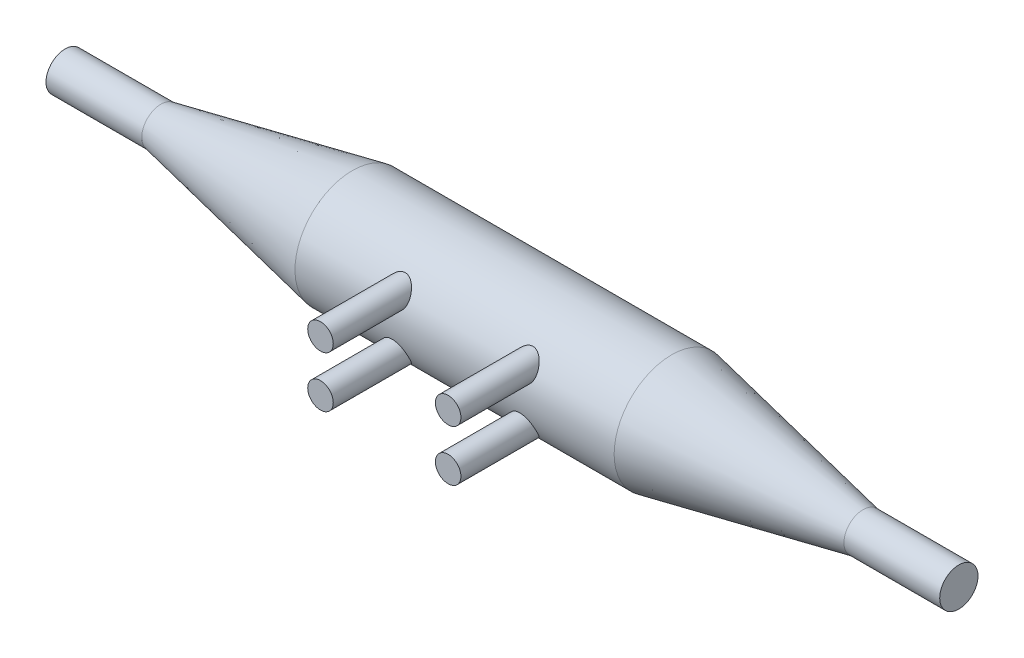
ISO-10303-21;
HEADER;
FILE_DESCRIPTION(('STEP AP214'),'2;1');
FILE_NAME('part.step','',(''),(''),'','','');
FILE_SCHEMA(('AUTOMOTIVE_DESIGN { 1 0 10303 214 1 1 1 1 }'));
ENDSEC;
DATA;
#1=APPLICATION_CONTEXT('core data for automotive mechanical design processes');
#2=APPLICATION_PROTOCOL_DEFINITION('international standard','automotive_design',2000,#1);
#3=PRODUCT_CONTEXT('',#1,'mechanical');
#4=PRODUCT('Part','Part','',(#3));
#5=PRODUCT_RELATED_PRODUCT_CATEGORY('part','',(#4));
#6=PRODUCT_DEFINITION_FORMATION('','',#4);
#7=PRODUCT_DEFINITION_CONTEXT('part definition',#1,'design');
#8=PRODUCT_DEFINITION('design','',#6,#7);
#9=PRODUCT_DEFINITION_SHAPE('','',#8);
#10=(LENGTH_UNIT() NAMED_UNIT(*) SI_UNIT(.MILLI.,.METRE.));
#11=(NAMED_UNIT(*) PLANE_ANGLE_UNIT() SI_UNIT($,.RADIAN.));
#12=(NAMED_UNIT(*) SI_UNIT($,.STERADIAN.) SOLID_ANGLE_UNIT());
#13=UNCERTAINTY_MEASURE_WITH_UNIT(LENGTH_MEASURE(1.E-05),#10,'distance_accuracy_value','');
#14=(GEOMETRIC_REPRESENTATION_CONTEXT(3) GLOBAL_UNCERTAINTY_ASSIGNED_CONTEXT((#13)) GLOBAL_UNIT_ASSIGNED_CONTEXT((#10,
#11,#12)) REPRESENTATION_CONTEXT('',''));
#15=CARTESIAN_POINT('',(0.,0.,0.));
#16=DIRECTION('',(0.,0.,1.));
#17=DIRECTION('',(1.,0.,0.));
#18=AXIS2_PLACEMENT_3D('',#15,#16,#17);
#19=CARTESIAN_POINT('',(123.259169382463,0.,0.));
#20=DIRECTION('',(1.,0.,0.));
#21=DIRECTION('',(0.,1.,0.));
#22=AXIS2_PLACEMENT_3D('',#19,#20,#21);
#23=CYLINDRICAL_SURFACE('',#22,9.);
#24=CARTESIAN_POINT('',(61.2591693824631,3.99999999999999,8.06225774829855));
#25=CARTESIAN_POINT('',(61.2591714976189,4.12894286634209,7.99828035942443));
#26=CARTESIAN_POINT('',(61.2716561331025,4.25636317802112,7.93117108595877));
#27=CARTESIAN_POINT('',(61.319719987755,4.50453397744185,7.79290857464164));
#28=CARTESIAN_POINT('',(61.3553252244888,4.62527678469448,7.72175086349652));
#29=CARTESIAN_POINT('',(61.4477930596246,4.85699742894243,7.57813396711227));
#30=CARTESIAN_POINT('',(61.5046033625781,4.96799846586629,7.50567839770059));
#31=CARTESIAN_POINT('',(61.6382866022753,5.17824136437868,7.36220031286894));
#32=CARTESIAN_POINT('',(61.7151531335041,5.27748696570533,7.29117734769489));
#33=CARTESIAN_POINT('',(61.8758580532884,5.44851310528983,7.16403562594676));
#34=CARTESIAN_POINT('',(61.9571375160229,5.52219197700484,7.10723607487638));
#35=CARTESIAN_POINT('',(62.1335477857292,5.65688001901286,7.00050468601119));
#36=CARTESIAN_POINT('',(62.2286586521216,5.717907127074,6.95056315927194));
#37=CARTESIAN_POINT('',(62.4096514297126,5.81283201869437,6.87124103534053));
#38=CARTESIAN_POINT('',(62.4930199570994,5.84974382593508,6.83975177537049));
#39=CARTESIAN_POINT('',(62.6665861314915,5.91241586631125,6.78565094760879));
#40=CARTESIAN_POINT('',(62.7567776843755,5.93818591592911,6.76303156662231));
#41=CARTESIAN_POINT('',(62.9426795345743,5.97709611066786,6.72867160916216));
#42=CARTESIAN_POINT('',(63.038427047456,5.99013726085479,6.71701632740416));
#43=CARTESIAN_POINT('',(63.2314938270432,6.00214135784504,6.70629375313919));
#44=CARTESIAN_POINT('',(63.3288122132202,6.00111193549045,6.70721963753282));
#45=CARTESIAN_POINT('',(63.5096647599325,5.98607267638007,6.72063993539285));
#46=CARTESIAN_POINT('',(63.5934463000822,5.97364265482082,6.73172624829218));
#47=CARTESIAN_POINT('',(63.7572436070403,5.93879796172869,6.76248579107337));
#48=CARTESIAN_POINT('',(63.8372584597572,5.91638088022875,6.78216109353229));
#49=CARTESIAN_POINT('',(63.9959460978089,5.8613361263742,6.8297963028568));
#50=CARTESIAN_POINT('',(64.0743458140676,5.82824894695552,6.85812523054905));
#51=CARTESIAN_POINT('',(64.224420522914,5.75366083402505,6.92082123981718));
#52=CARTESIAN_POINT('',(64.2960902710201,5.71215341715547,6.95519297145433));
#53=CARTESIAN_POINT('',(64.4659996679798,5.59952552075418,7.04647541229048));
#54=CARTESIAN_POINT('',(64.5598192136922,5.52391986035748,7.10611804947971));
#55=CARTESIAN_POINT('',(64.7308194381208,5.35954219989074,7.23090582968093));
#56=CARTESIAN_POINT('',(64.807973174702,5.27074926636729,7.29605964902877));
#57=CARTESIAN_POINT('',(64.9459064370894,5.08111744991,7.42938965369951));
#58=CARTESIAN_POINT('',(65.0064789752838,4.9801471354169,7.49759267611869));
#59=CARTESIAN_POINT('',(65.1091384320329,4.76902020080054,7.63362460007947));
#60=CARTESIAN_POINT('',(65.1512281289203,4.65886496431493,7.70145355633586));
#61=CARTESIAN_POINT('',(65.2189672178032,4.41971970238256,7.84137353680838));
#62=CARTESIAN_POINT('',(65.2424941703724,4.28995570157253,7.91319067660219));
#63=CARTESIAN_POINT('',(65.2634050975815,4.02526050938796,8.05105623263003));
#64=CARTESIAN_POINT('',(65.2607940115788,3.89033029908306,8.11710573640619));
#65=CARTESIAN_POINT('',(65.2286393274979,3.62956745613372,8.23683086029777));
#66=CARTESIAN_POINT('',(65.2009835084253,3.50375547837379,8.2910478214332));
#67=CARTESIAN_POINT('',(65.120522554561,3.256922690931,8.39107526808627));
#68=CARTESIAN_POINT('',(65.0677419246999,3.13589733702469,8.43689388456359));
#69=CARTESIAN_POINT('',(64.9453721211585,2.91813526407127,8.51447437291231));
#70=CARTESIAN_POINT('',(64.8785201147512,2.82022044132328,8.547259029167));
#71=CARTESIAN_POINT('',(64.7272409266857,2.63658792078015,8.60567781952309));
#72=CARTESIAN_POINT('',(64.642821721995,2.5508647166171,8.63131518676743));
#73=CARTESIAN_POINT('',(64.4659385481601,2.40121829894836,8.67408590301764));
#74=CARTESIAN_POINT('',(64.3745747317556,2.3361329426058,8.69171772859771));
#75=CARTESIAN_POINT('',(64.1815926991063,2.22188298842516,8.72162459247042));
#76=CARTESIAN_POINT('',(64.0799762920694,2.17271558807147,8.73390057384551));
#77=CARTESIAN_POINT('',(63.8722567725793,2.09312381075841,8.75331232187594));
#78=CARTESIAN_POINT('',(63.7663388944744,2.0622455390548,8.76057338362394));
#79=CARTESIAN_POINT('',(63.5506698031292,2.01829960870119,8.77080281204677));
#80=CARTESIAN_POINT('',(63.4409187223279,2.00523133532975,8.77377132688132));
#81=CARTESIAN_POINT('',(63.2212285486073,1.99735458192708,8.77556786215419));
#82=CARTESIAN_POINT('',(63.1112925396853,2.00246395884202,8.77441450881163));
#83=CARTESIAN_POINT('',(62.8938620936641,2.03059237542131,8.76794726549786));
#84=CARTESIAN_POINT('',(62.786367620267,2.05361114865106,8.76263343742122));
#85=CARTESIAN_POINT('',(62.5768899528712,2.11679521220174,8.74758388814477));
#86=CARTESIAN_POINT('',(62.4749057549833,2.1569573673096,8.73784897546021));
#87=CARTESIAN_POINT('',(62.279306336698,2.25307646560481,8.71355789090752));
#88=CARTESIAN_POINT('',(62.18569075506,2.30903272658809,8.69900192727317));
#89=CARTESIAN_POINT('',(62.0092079799698,2.43495337971592,8.66459780827522));
#90=CARTESIAN_POINT('',(61.9263636797301,2.50494682935801,8.6447386463461));
#91=CARTESIAN_POINT('',(61.7737804581775,2.65643043337969,8.59939614696698));
#92=CARTESIAN_POINT('',(61.7040418127922,2.73792082975373,8.57391269112718));
#93=CARTESIAN_POINT('',(61.5782486541744,2.91091052214103,8.51674867028052));
#94=CARTESIAN_POINT('',(61.5224171755117,3.00254261226738,8.48498016654166));
#95=CARTESIAN_POINT('',(61.4267064699945,3.19171559160702,8.41564601450613));
#96=CARTESIAN_POINT('',(61.3868282743357,3.28925686231159,8.37807999168418));
#97=CARTESIAN_POINT('',(61.3226792121092,3.48893821901558,8.29693347822424));
#98=CARTESIAN_POINT('',(61.2986754023116,3.59112752152574,8.25326434922474));
#99=CARTESIAN_POINT('',(61.2669155663079,3.79585953040615,8.1611324512423));
#100=CARTESIAN_POINT('',(61.259167715874,3.89840238863849,8.11266728296417));
#101=CARTESIAN_POINT('',(61.2591693824631,3.99999999999999,8.06225774829855));
#102=B_SPLINE_CURVE_WITH_KNOTS('',3,(#24,#25,#26,#27,#28,#29,#30,#31,#32,#33,#34,#35,#36,#37,
#38,#39,#40,#41,#42,#43,#44,#45,#46,#47,#48,#49,#50,#51,#52,#53,#54,#55,#56,#57,#58,#59,#60,#61,
#62,#63,#64,#65,#66,#67,#68,#69,#70,#71,#72,#73,#74,#75,#76,#77,#78,#79,#80,#81,#82,#83,#84,#85,
#86,#87,#88,#89,#90,#91,#92,#93,#94,#95,#96,#97,#98,#99,#100,#101),.UNSPECIFIED.,.T.,.F.,(4,2,2,
2,2,2,2,2,2,2,2,2,2,2,2,2,2,2,2,2,2,2,2,2,2,2,2,2,2,2,2,2,2,2,2,2,2,2,4),(0.,0.431384036925384,
0.863254352620981,1.2940665620274,1.72474134761833,2.09397692398629,2.46268535999728,
2.75095537535825,3.03897088932175,3.32920891511334,3.61928954342715,3.87439949676249,
4.12957104378783,4.39766220665997,4.66596058144565,5.06713507760775,5.46895334212838,
5.87557990813472,6.28214532927037,6.73030426501385,7.1783785128669,7.59525649002182,
8.01172870490679,8.37878937071907,8.74568372278498,9.08467398018687,9.42360452246101,
9.75372677989922,10.0838376427057,10.412458664781,10.741074798119,11.0696308592682,
11.3981727310744,11.7274018499288,12.0566378996242,12.3908559014187,12.7250955030616,
13.0648239632767,13.4047232456055),.UNSPECIFIED.);
#103=CARTESIAN_POINT('',(61.2591693824631,3.99999999999999,8.06225774829855));
#104=VERTEX_POINT('',#103);
#105=EDGE_CURVE('E110',#104,#104,#102,.T.);
#106=ORIENTED_EDGE('',*,*,#105,.T.);
#107=EDGE_LOOP('',(#106));
#108=FACE_BOUND('',#107,.T.);
#109=CARTESIAN_POINT('',(41.2591693824631,3.99999999999999,8.06225774829855));
#110=CARTESIAN_POINT('',(41.2591714976189,4.12894286634209,7.99828035942443));
#111=CARTESIAN_POINT('',(41.2716561331024,4.25636317802113,7.93117108595877));
#112=CARTESIAN_POINT('',(41.3197199877549,4.50453397744185,7.79290857464164));
#113=CARTESIAN_POINT('',(41.3553252244888,4.62527678469448,7.72175086349652));
#114=CARTESIAN_POINT('',(41.4477930596246,4.85699742894243,7.57813396711227));
#115=CARTESIAN_POINT('',(41.5046033625781,4.96799846586629,7.50567839770059));
#116=CARTESIAN_POINT('',(41.6382866022753,5.17824136437868,7.36220031286893));
#117=CARTESIAN_POINT('',(41.7151531335041,5.27748696570533,7.29117734769488));
#118=CARTESIAN_POINT('',(41.8758580532883,5.44851310528984,7.16403562594676));
#119=CARTESIAN_POINT('',(41.9571375160229,5.52219197700484,7.10723607487638));
#120=CARTESIAN_POINT('',(42.1335477857292,5.65688001901286,7.00050468601119));
#121=CARTESIAN_POINT('',(42.2286586521216,5.71790712707401,6.95056315927193));
#122=CARTESIAN_POINT('',(42.4096514297126,5.81283201869437,6.87124103534052));
#123=CARTESIAN_POINT('',(42.4930199570994,5.84974382593509,6.83975177537048));
#124=CARTESIAN_POINT('',(42.6665861314915,5.91241586631126,6.78565094760878));
#125=CARTESIAN_POINT('',(42.7567776843755,5.93818591592912,6.7630315666223));
#126=CARTESIAN_POINT('',(42.9426795345743,5.97709611066786,6.72867160916215));
#127=CARTESIAN_POINT('',(43.038427047456,5.9901372608548,6.71701632740416));
#128=CARTESIAN_POINT('',(43.2314938270431,6.00214135784505,6.70629375313918));
#129=CARTESIAN_POINT('',(43.3288122132202,6.00111193549046,6.70721963753282));
#130=CARTESIAN_POINT('',(43.5096647599325,5.98607267638007,6.72063993539284));
#131=CARTESIAN_POINT('',(43.5934463000822,5.97364265482083,6.73172624829217));
#132=CARTESIAN_POINT('',(43.7572436070403,5.9387979617287,6.76248579107336));
#133=CARTESIAN_POINT('',(43.8372584597572,5.91638088022875,6.78216109353228));
#134=CARTESIAN_POINT('',(43.9959460978089,5.86133612637421,6.82979630285679));
#135=CARTESIAN_POINT('',(44.0743458140676,5.82824894695553,6.85812523054904));
#136=CARTESIAN_POINT('',(44.224420522914,5.75366083402506,6.92082123981717));
#137=CARTESIAN_POINT('',(44.2960902710201,5.71215341715548,6.95519297145433));
#138=CARTESIAN_POINT('',(44.4659996679798,5.59952552075418,7.04647541229048));
#139=CARTESIAN_POINT('',(44.5598192136922,5.52391986035748,7.10611804947971));
#140=CARTESIAN_POINT('',(44.7308194381208,5.35954219989074,7.23090582968093));
#141=CARTESIAN_POINT('',(44.807973174702,5.27074926636729,7.29605964902877));
#142=CARTESIAN_POINT('',(44.9459064370894,5.08111744990999,7.42938965369951));
#143=CARTESIAN_POINT('',(45.0064789752838,4.9801471354169,7.49759267611869));
#144=CARTESIAN_POINT('',(45.1091384320329,4.76902020080053,7.63362460007947));
#145=CARTESIAN_POINT('',(45.1512281289203,4.65886496431492,7.70145355633586));
#146=CARTESIAN_POINT('',(45.2189672178032,4.41971970238255,7.84137353680838));
#147=CARTESIAN_POINT('',(45.2424941703724,4.28995570157253,7.91319067660219));
#148=CARTESIAN_POINT('',(45.2634050975815,4.02526050938796,8.05105623263004));
#149=CARTESIAN_POINT('',(45.2607940115788,3.89033029908306,8.11710573640619));
#150=CARTESIAN_POINT('',(45.2286393274979,3.62956745613372,8.23683086029777));
#151=CARTESIAN_POINT('',(45.2009835084252,3.50375547837379,8.2910478214332));
#152=CARTESIAN_POINT('',(45.120522554561,3.25692269093099,8.39107526808627));
#153=CARTESIAN_POINT('',(45.0677419246999,3.13589733702468,8.43689388456359));
#154=CARTESIAN_POINT('',(44.9453721211585,2.91813526407126,8.51447437291231));
#155=CARTESIAN_POINT('',(44.8785201147511,2.82022044132328,8.547259029167));
#156=CARTESIAN_POINT('',(44.7272409266857,2.63658792078014,8.60567781952309));
#157=CARTESIAN_POINT('',(44.642821721995,2.55086471661709,8.63131518676744));
#158=CARTESIAN_POINT('',(44.4659385481601,2.40121829894835,8.67408590301764));
#159=CARTESIAN_POINT('',(44.3745747317556,2.3361329426058,8.69171772859771));
#160=CARTESIAN_POINT('',(44.1815926991063,2.22188298842515,8.72162459247042));
#161=CARTESIAN_POINT('',(44.0799762920694,2.17271558807146,8.73390057384551));
#162=CARTESIAN_POINT('',(43.8722567725792,2.0931238107584,8.75331232187594));
#163=CARTESIAN_POINT('',(43.7663388944744,2.06224553905479,8.76057338362394));
#164=CARTESIAN_POINT('',(43.5506698031292,2.01829960870118,8.77080281204677));
#165=CARTESIAN_POINT('',(43.4409187223279,2.00523133532974,8.77377132688132));
#166=CARTESIAN_POINT('',(43.2212285486072,1.99735458192708,8.7755678621542));
#167=CARTESIAN_POINT('',(43.1112925396853,2.00246395884201,8.77441450881163));
#168=CARTESIAN_POINT('',(42.8938620936641,2.0305923754213,8.76794726549786));
#169=CARTESIAN_POINT('',(42.786367620267,2.05361114865106,8.76263343742122));
#170=CARTESIAN_POINT('',(42.5768899528712,2.11679521220173,8.74758388814477));
#171=CARTESIAN_POINT('',(42.4749057549833,2.1569573673096,8.7378489754602));
#172=CARTESIAN_POINT('',(42.279306336698,2.25307646560481,8.71355789090752));
#173=CARTESIAN_POINT('',(42.18569075506,2.30903272658809,8.69900192727317));
#174=CARTESIAN_POINT('',(42.0092079799698,2.43495337971592,8.66459780827522));
#175=CARTESIAN_POINT('',(41.92636367973,2.50494682935801,8.6447386463461));
#176=CARTESIAN_POINT('',(41.7737804581775,2.6564304333797,8.59939614696698));
#177=CARTESIAN_POINT('',(41.7040418127921,2.73792082975374,8.57391269112718));
#178=CARTESIAN_POINT('',(41.5782486541744,2.91091052214103,8.51674867028052));
#179=CARTESIAN_POINT('',(41.5224171755117,3.00254261226738,8.48498016654165));
#180=CARTESIAN_POINT('',(41.4267064699945,3.19171559160702,8.41564601450613));
#181=CARTESIAN_POINT('',(41.3868282743357,3.28925686231159,8.37807999168418));
#182=CARTESIAN_POINT('',(41.3226792121092,3.48893821901559,8.29693347822423));
#183=CARTESIAN_POINT('',(41.2986754023116,3.59112752152575,8.25326434922474));
#184=CARTESIAN_POINT('',(41.2669155663079,3.79585953040615,8.16113245124229));
#185=CARTESIAN_POINT('',(41.259167715874,3.89840238863849,8.11266728296417));
#186=CARTESIAN_POINT('',(41.2591693824631,3.99999999999999,8.06225774829855));
#187=B_SPLINE_CURVE_WITH_KNOTS('',3,(#109,#110,#111,#112,#113,#114,#115,#116,#117,#118,#119,
#120,#121,#122,#123,#124,#125,#126,#127,#128,#129,#130,#131,#132,#133,#134,#135,#136,#137,#138,
#139,#140,#141,#142,#143,#144,#145,#146,#147,#148,#149,#150,#151,#152,#153,#154,#155,#156,#157,
#158,#159,#160,#161,#162,#163,#164,#165,#166,#167,#168,#169,#170,#171,#172,#173,#174,#175,#176,
#177,#178,#179,#180,#181,#182,#183,#184,#185,#186),.UNSPECIFIED.,.T.,.F.,(4,2,2,2,2,2,2,2,2,2,2,
2,2,2,2,2,2,2,2,2,2,2,2,2,2,2,2,2,2,2,2,2,2,2,2,2,2,2,4),(0.,0.431384036925386,
0.863254352620985,1.2940665620274,1.72474134761834,2.0939769239863,2.46268535999729,
2.75095537535826,3.03897088932175,3.32920891511334,3.61928954342715,3.87439949676251,
4.12957104378784,4.39766220665998,4.66596058144567,5.06713507760778,5.46895334212841,
5.87557990813476,6.2821453292704,6.73030426501388,7.17837851286693,7.59525649002185,
8.01172870490682,8.3787893707191,8.74568372278502,9.08467398018691,9.42360452246104,
9.75372677989927,10.0838376427057,10.412458664781,10.741074798119,11.0696308592683,
11.3981727310745,11.7274018499289,12.0566378996242,12.3908559014187,12.7250955030616,
13.0648239632767,13.4047232456055),.UNSPECIFIED.);
#188=CARTESIAN_POINT('',(41.2591693824631,3.99999999999999,8.06225774829855));
#189=VERTEX_POINT('',#188);
#190=EDGE_CURVE('E59',#189,#189,#187,.T.);
#191=ORIENTED_EDGE('',*,*,#190,.T.);
#192=EDGE_LOOP('',(#191));
#193=FACE_BOUND('',#192,.T.);
#194=CARTESIAN_POINT('',(28.2591693824631,0.,0.));
#195=DIRECTION('',(1.,0.,0.));
#196=DIRECTION('',(0.,1.,0.));
#197=AXIS2_PLACEMENT_3D('',#194,#195,#196);
#198=CIRCLE('',#197,9.00000000000001);
#199=CARTESIAN_POINT('',(28.2591693824631,9.,0.));
#200=VERTEX_POINT('',#199);
#201=EDGE_CURVE('E55',#200,#200,#198,.T.);
#202=ORIENTED_EDGE('',*,*,#201,.T.);
#203=EDGE_LOOP('',(#202));
#204=FACE_BOUND('',#203,.T.);
#205=CARTESIAN_POINT('',(78.2591693824631,0.,0.));
#206=DIRECTION('',(1.,0.,0.));
#207=DIRECTION('',(0.,1.,0.));
#208=AXIS2_PLACEMENT_3D('',#205,#206,#207);
#209=CIRCLE('',#208,8.99999999999999);
#210=CARTESIAN_POINT('',(78.2591693824631,-8.99999999999999,0.));
#211=VERTEX_POINT('',#210);
#212=EDGE_CURVE('E118',#211,#211,#209,.T.);
#213=ORIENTED_EDGE('',*,*,#212,.F.);
#214=EDGE_LOOP('',(#213));
#215=FACE_BOUND('',#214,.T.);
#216=CARTESIAN_POINT('',(41.2591693824631,-4.00000000000001,8.06225774829855));
#217=CARTESIAN_POINT('',(41.2591729859442,-3.88819498255086,8.1177251933736));
#218=CARTESIAN_POINT('',(41.2685685907921,-3.77508517782307,8.17092075009496));
#219=CARTESIAN_POINT('',(41.30721541854,-3.54944309654731,8.271441782327));
#220=CARTESIAN_POINT('',(41.3364967383582,-3.436911956295,8.31875823124603));
#221=CARTESIAN_POINT('',(41.4155272172496,-3.21591588631707,8.4066679756264));
#222=CARTESIAN_POINT('',(41.4653464534785,-3.10746627941771,8.44723757854511));
#223=CARTESIAN_POINT('',(41.5849277564581,-2.89941348659936,8.52089123641491));
#224=CARTESIAN_POINT('',(41.6546760492535,-2.79980425276625,8.5539804332487));
#225=CARTESIAN_POINT('',(41.8066973583322,-2.62045938949496,8.61054074377932));
#226=CARTESIAN_POINT('',(41.8876950670757,-2.53980633880364,8.63453538190431));
#227=CARTESIAN_POINT('',(42.0632130519027,-2.3928984550645,8.67639825696416));
#228=CARTESIAN_POINT('',(42.1577309090597,-2.32664105178206,8.69426758785626));
#229=CARTESIAN_POINT('',(42.3529015860046,-2.21371417940273,8.72368809535034));
#230=CARTESIAN_POINT('',(42.4530840575554,-2.16629475393258,8.73548832687957));
#231=CARTESIAN_POINT('',(42.660292601347,-2.08856419647635,8.75439947513368));
#232=CARTESIAN_POINT('',(42.7673180130088,-2.05825141587858,8.76151084374754));
#233=CARTESIAN_POINT('',(42.9838498777503,-2.01600656535591,8.77132754200847));
#234=CARTESIAN_POINT('',(43.0933138483301,-2.00386785521057,8.77408242570912));
#235=CARTESIAN_POINT('',(43.3127770044608,-1.99770740418875,8.77548724023928));
#236=CARTESIAN_POINT('',(43.4227761830643,-2.0036854287615,8.77413722421343));
#237=CARTESIAN_POINT('',(43.6400485693977,-2.03354596502222,8.76726416460684));
#238=CARTESIAN_POINT('',(43.7473248748113,-2.05740709246258,8.76174610502532));
#239=CARTESIAN_POINT('',(43.956242202485,-2.12222200308059,8.74627207643438));
#240=CARTESIAN_POINT('',(44.0578833814932,-2.16317531054808,8.73631623093705));
#241=CARTESIAN_POINT('',(44.2527181767486,-2.26082216125914,8.71155602780751));
#242=CARTESIAN_POINT('',(44.3459076678058,-2.31752333662496,8.69674931860299));
#243=CARTESIAN_POINT('',(44.5212248308717,-2.44470459043707,8.66185618974943));
#244=CARTESIAN_POINT('',(44.6033528953683,-2.51518417977227,8.6417699575061));
#245=CARTESIAN_POINT('',(44.7549712686839,-2.66799430440358,8.59582444728445));
#246=CARTESIAN_POINT('',(44.8243727830543,-2.75040142221722,8.5699272174494));
#247=CARTESIAN_POINT('',(44.9483379776932,-2.92385935886841,8.51230813394993));
#248=CARTESIAN_POINT('',(45.0029005275275,-3.01491083552193,8.48058583683931));
#249=CARTESIAN_POINT('',(45.0977710474321,-3.20551011891369,8.41042867822864));
#250=CARTESIAN_POINT('',(45.1376022443884,-3.30523087431734,8.37182098179081));
#251=CARTESIAN_POINT('',(45.2005036866402,-3.50759651586803,8.28907284054095));
#252=CARTESIAN_POINT('',(45.2235689877717,-3.61024225530961,8.24493076816991));
#253=CARTESIAN_POINT('',(45.2544397500707,-3.82312754935519,8.14851541370557));
#254=CARTESIAN_POINT('',(45.2610247616973,-3.93338090229953,8.09588531033252));
#255=CARTESIAN_POINT('',(45.2564171415442,-4.15131916891199,7.98632923797797));
#256=CARTESIAN_POINT('',(45.2452183844585,-4.25900318464907,7.92940179528666));
#257=CARTESIAN_POINT('',(45.2040631242515,-4.48114951889358,7.80622338609317));
#258=CARTESIAN_POINT('',(45.172192958991,-4.59506910691463,7.73963291253861));
#259=CARTESIAN_POINT('',(45.0894159397671,-4.81487016251242,7.60484632327977));
#260=CARTESIAN_POINT('',(45.0384888443836,-4.92074293875491,7.5366485728255));
#261=CARTESIAN_POINT('',(44.9129966020151,-5.13196979534894,7.39463053360367));
#262=CARTESIAN_POINT('',(44.8366492326262,-5.23632466438319,7.32088961184441));
#263=CARTESIAN_POINT('',(44.663267978129,-5.43016929205724,7.17827956260325));
#264=CARTESIAN_POINT('',(44.5662555356668,-5.51967428938179,7.109405483056));
#265=CARTESIAN_POINT('',(44.381688038508,-5.65811904566685,6.99937541279924));
#266=CARTESIAN_POINT('',(44.2988579354835,-5.71144756303145,6.95580304501223));
#267=CARTESIAN_POINT('',(44.1232736680207,-5.80644568979588,6.87669980283816));
#268=CARTESIAN_POINT('',(44.0305362741252,-5.84813458297591,6.84115564672017));
#269=CARTESIAN_POINT('',(43.8529696581547,-5.91173518548809,6.78622550888166));
#270=CARTESIAN_POINT('',(43.7694480800287,-5.93579745661685,6.76512477843832));
#271=CARTESIAN_POINT('',(43.5982145511026,-5.97299378830131,6.73230798201385));
#272=CARTESIAN_POINT('',(43.5105056727272,-5.98613573516691,6.72058514384654));
#273=CARTESIAN_POINT('',(43.3329986035714,-6.00062579069746,6.7076518284385));
#274=CARTESIAN_POINT('',(43.2431939277761,-6.00193045064402,6.70648007904929));
#275=CARTESIAN_POINT('',(43.0647295137664,-5.99253138952388,6.71487920991738));
#276=CARTESIAN_POINT('',(42.976069934178,-5.98182602242163,6.72445156270886));
#277=CARTESIAN_POINT('',(42.8072448962726,-5.95006425123586,6.75256582382558));
#278=CARTESIAN_POINT('',(42.7268791991748,-5.92959708175384,6.77059627879863));
#279=CARTESIAN_POINT('',(42.5710815493275,-5.87969123902814,6.81397987778612));
#280=CARTESIAN_POINT('',(42.4956527121974,-5.85024696545914,6.83933759236055));
#281=CARTESIAN_POINT('',(42.3214516484762,-5.77008904778911,6.90722879110724));
#282=CARTESIAN_POINT('',(42.2255132010573,-5.71558526173381,6.95256658591336));
#283=CARTESIAN_POINT('',(42.0463353817258,-5.59398902651009,7.05077335272773));
#284=CARTESIAN_POINT('',(41.963115059403,-5.52687802261082,7.1036533971018));
#285=CARTESIAN_POINT('',(41.8085984866595,-5.38105123056526,7.21476416384232));
#286=CARTESIAN_POINT('',(41.7375147629874,-5.30216666295077,7.27306706934971));
#287=CARTESIAN_POINT('',(41.6092398167879,-5.13526103107292,7.3918605880246));
#288=CARTESIAN_POINT('',(41.5520559363453,-5.04723517313959,7.45235233807304));
#289=CARTESIAN_POINT('',(41.4419583414773,-4.8447456227986,7.58590585844797));
#290=CARTESIAN_POINT('',(41.3922790530782,-4.72854627184658,7.65902169439187));
#291=CARTESIAN_POINT('',(41.3154246085588,-4.48761997835233,7.80261728677751));
#292=CARTESIAN_POINT('',(41.2881992615288,-4.36291273321513,7.87310258437512));
#293=CARTESIAN_POINT('',(41.2684872785497,-4.19676513471166,7.96172849226288));
#294=CARTESIAN_POINT('',(41.2650078080679,-4.15769235533063,7.98220181716867));
#295=CARTESIAN_POINT('',(41.2603479798012,-4.07913447120783,8.02263132252688));
#296=CARTESIAN_POINT('',(41.2591681045648,-4.03964928167291,8.04258739357178));
#297=CARTESIAN_POINT('',(41.2591693824631,-4.00000000000001,8.06225774829855));
#298=B_SPLINE_CURVE_WITH_KNOTS('',3,(#216,#217,#218,#219,#220,#221,#222,#223,#224,#225,#226,
#227,#228,#229,#230,#231,#232,#233,#234,#235,#236,#237,#238,#239,#240,#241,#242,#243,#244,#245,
#246,#247,#248,#249,#250,#251,#252,#253,#254,#255,#256,#257,#258,#259,#260,#261,#262,#263,#264,
#265,#266,#267,#268,#269,#270,#271,#272,#273,#274,#275,#276,#277,#278,#279,#280,#281,#282,#283,
#284,#285,#286,#287,#288,#289,#290,#291,#292,#293,#294,#295,#296,#297),.UNSPECIFIED.,.T.,.F.,(4,
2,2,2,2,2,2,2,2,2,2,2,2,2,2,2,2,2,2,2,2,2,2,2,2,2,2,2,2,2,2,2,2,2,2,2,2,2,2,2,4),(0.,
0.374267942088713,0.749103602732428,1.1252289623851,1.50109498944482,1.84969992810314,
2.19824257473012,2.53103241953376,2.86379018703846,3.19273495876871,3.52167547178865,
3.8502232708187,4.17876192630471,4.50746008502505,4.83614657761784,5.16704566925021,
5.49796996176234,5.83882253859479,6.17977559011071,6.54531708352482,6.91098450858127,
7.3165572042518,7.72256190956059,8.16702738151458,8.6110338910956,8.93304823364123,
9.25452587434948,9.52173622115511,9.78875342904813,10.056750327903,10.3247839615893,
10.5783656349547,10.83210582891,11.1880412522694,11.5445046886308,11.9066822218362,
12.269050648395,12.7051259700326,13.1402238777285,13.2729222347804,13.4056484343337),.UNSPECIFIED.);
#299=CARTESIAN_POINT('',(41.2591693824631,-4.00000000000001,8.06225774829855));
#300=VERTEX_POINT('',#299);
#301=EDGE_CURVE('E68',#300,#300,#298,.T.);
#302=ORIENTED_EDGE('',*,*,#301,.T.);
#303=EDGE_LOOP('',(#302));
#304=FACE_BOUND('',#303,.T.);
#305=CARTESIAN_POINT('',(61.2591693824631,-4.00000000000001,8.06225774829855));
#306=CARTESIAN_POINT('',(61.2591729859442,-3.88819498255086,8.11772519337359));
#307=CARTESIAN_POINT('',(61.2685685907922,-3.77508517782307,8.17092075009496));
#308=CARTESIAN_POINT('',(61.30721541854,-3.54944309654731,8.271441782327));
#309=CARTESIAN_POINT('',(61.3364967383582,-3.43691195629501,8.31875823124603));
#310=CARTESIAN_POINT('',(61.4155272172496,-3.21591588631707,8.4066679756264));
#311=CARTESIAN_POINT('',(61.4653464534785,-3.10746627941771,8.44723757854511));
#312=CARTESIAN_POINT('',(61.5849277564581,-2.89941348659936,8.5208912364149));
#313=CARTESIAN_POINT('',(61.6546760492535,-2.79980425276625,8.5539804332487));
#314=CARTESIAN_POINT('',(61.8066973583322,-2.62045938949496,8.61054074377932));
#315=CARTESIAN_POINT('',(61.8876950670757,-2.53980633880364,8.6345353819043));
#316=CARTESIAN_POINT('',(62.0632130519027,-2.3928984550645,8.67639825696416));
#317=CARTESIAN_POINT('',(62.1577309090597,-2.32664105178206,8.69426758785626));
#318=CARTESIAN_POINT('',(62.3529015860046,-2.21371417940273,8.72368809535034));
#319=CARTESIAN_POINT('',(62.4530840575554,-2.16629475393259,8.73548832687957));
#320=CARTESIAN_POINT('',(62.660292601347,-2.08856419647636,8.75439947513367));
#321=CARTESIAN_POINT('',(62.7673180130088,-2.05825141587859,8.76151084374754));
#322=CARTESIAN_POINT('',(62.9838498777503,-2.01600656535592,8.77132754200847));
#323=CARTESIAN_POINT('',(63.0933138483301,-2.00386785521057,8.77408242570912));
#324=CARTESIAN_POINT('',(63.3127770044608,-1.99770740418876,8.77548724023928));
#325=CARTESIAN_POINT('',(63.4227761830643,-2.00368542876151,8.77413722421343));
#326=CARTESIAN_POINT('',(63.6400485693977,-2.03354596502222,8.76726416460684));
#327=CARTESIAN_POINT('',(63.7473248748113,-2.05740709246258,8.76174610502532));
#328=CARTESIAN_POINT('',(63.9562422024851,-2.12222200308059,8.74627207643438));
#329=CARTESIAN_POINT('',(64.0578833814932,-2.16317531054809,8.73631623093705));
#330=CARTESIAN_POINT('',(64.2527181767486,-2.26082216125915,8.71155602780751));
#331=CARTESIAN_POINT('',(64.3459076678058,-2.31752333662497,8.69674931860298));
#332=CARTESIAN_POINT('',(64.5212248308717,-2.44470459043708,8.66185618974943));
#333=CARTESIAN_POINT('',(64.6033528953683,-2.51518417977227,8.64176995750609));
#334=CARTESIAN_POINT('',(64.7549712686839,-2.66799430440357,8.59582444728445));
#335=CARTESIAN_POINT('',(64.8243727830543,-2.75040142221722,8.5699272174494));
#336=CARTESIAN_POINT('',(64.9483379776932,-2.92385935886841,8.51230813394993));
#337=CARTESIAN_POINT('',(65.0029005275275,-3.01491083552193,8.48058583683931));
#338=CARTESIAN_POINT('',(65.0977710474321,-3.20551011891369,8.41042867822864));
#339=CARTESIAN_POINT('',(65.1376022443885,-3.30523087431734,8.37182098179081));
#340=CARTESIAN_POINT('',(65.2005036866402,-3.50759651586803,8.28907284054095));
#341=CARTESIAN_POINT('',(65.2235689877717,-3.61024225530961,8.24493076816991));
#342=CARTESIAN_POINT('',(65.2544397500707,-3.82312754935519,8.14851541370557));
#343=CARTESIAN_POINT('',(65.2610247616973,-3.93338090229954,8.09588531033252));
#344=CARTESIAN_POINT('',(65.2564171415442,-4.15131916891199,7.98632923797797));
#345=CARTESIAN_POINT('',(65.2452183844585,-4.25900318464907,7.92940179528666));
#346=CARTESIAN_POINT('',(65.2040631242515,-4.48114951889358,7.80622338609317));
#347=CARTESIAN_POINT('',(65.1721929589909,-4.59506910691463,7.73963291253861));
#348=CARTESIAN_POINT('',(65.0894159397671,-4.81487016251242,7.60484632327977));
#349=CARTESIAN_POINT('',(65.0384888443836,-4.92074293875491,7.5366485728255));
#350=CARTESIAN_POINT('',(64.9129966020151,-5.13196979534893,7.39463053360367));
#351=CARTESIAN_POINT('',(64.8366492326262,-5.23632466438319,7.3208896118444));
#352=CARTESIAN_POINT('',(64.663267978129,-5.43016929205724,7.17827956260325));
#353=CARTESIAN_POINT('',(64.5662555356668,-5.51967428938179,7.109405483056));
#354=CARTESIAN_POINT('',(64.381688038508,-5.65811904566684,6.99937541279924));
#355=CARTESIAN_POINT('',(64.2988579354835,-5.71144756303145,6.95580304501223));
#356=CARTESIAN_POINT('',(64.1232736680207,-5.80644568979588,6.87669980283816));
#357=CARTESIAN_POINT('',(64.0305362741252,-5.84813458297591,6.84115564672017));
#358=CARTESIAN_POINT('',(63.8529696581547,-5.91173518548809,6.78622550888167));
#359=CARTESIAN_POINT('',(63.7694480800287,-5.93579745661685,6.76512477843832));
#360=CARTESIAN_POINT('',(63.5982145511026,-5.9729937883013,6.73230798201386));
#361=CARTESIAN_POINT('',(63.5105056727272,-5.98613573516691,6.72058514384654));
#362=CARTESIAN_POINT('',(63.3329986035714,-6.00062579069745,6.70765182843851));
#363=CARTESIAN_POINT('',(63.2431939277761,-6.00193045064401,6.7064800790493));
#364=CARTESIAN_POINT('',(63.0647295137664,-5.99253138952387,6.71487920991739));
#365=CARTESIAN_POINT('',(62.976069934178,-5.98182602242162,6.72445156270887));
#366=CARTESIAN_POINT('',(62.8072448962726,-5.95006425123585,6.75256582382559));
#367=CARTESIAN_POINT('',(62.7268791991747,-5.92959708175383,6.77059627879864));
#368=CARTESIAN_POINT('',(62.5710815493275,-5.87969123902812,6.81397987778613));
#369=CARTESIAN_POINT('',(62.4956527121973,-5.85024696545913,6.83933759236057));
#370=CARTESIAN_POINT('',(62.3214516484762,-5.7700890477891,6.90722879110725));
#371=CARTESIAN_POINT('',(62.2255132010573,-5.71558526173379,6.95256658591337));
#372=CARTESIAN_POINT('',(62.0463353817258,-5.59398902651007,7.05077335272774));
#373=CARTESIAN_POINT('',(61.963115059403,-5.5268780226108,7.10365339710182));
#374=CARTESIAN_POINT('',(61.8085984866594,-5.38105123056524,7.21476416384234));
#375=CARTESIAN_POINT('',(61.7375147629874,-5.30216666295075,7.27306706934973));
#376=CARTESIAN_POINT('',(61.6092398167879,-5.13526103107289,7.39186058802461));
#377=CARTESIAN_POINT('',(61.5520559363453,-5.04723517313956,7.45235233807306));
#378=CARTESIAN_POINT('',(61.4419583414773,-4.84474562279857,7.58590585844799));
#379=CARTESIAN_POINT('',(61.3922790530782,-4.72854627184656,7.65902169439189));
#380=CARTESIAN_POINT('',(61.3154246085588,-4.4876199783523,7.80261728677752));
#381=CARTESIAN_POINT('',(61.2881992615288,-4.36291273321509,7.87310258437514));
#382=CARTESIAN_POINT('',(61.2684872785498,-4.19676513471163,7.9617284922629));
#383=CARTESIAN_POINT('',(61.2650078080679,-4.15769235533061,7.98220181716868));
#384=CARTESIAN_POINT('',(61.2603479798013,-4.07913447120782,8.02263132252688));
#385=CARTESIAN_POINT('',(61.2591681045649,-4.0396492816729,8.04258739357178));
#386=CARTESIAN_POINT('',(61.2591693824631,-4.00000000000001,8.06225774829855));
#387=B_SPLINE_CURVE_WITH_KNOTS('',3,(#305,#306,#307,#308,#309,#310,#311,#312,#313,#314,#315,
#316,#317,#318,#319,#320,#321,#322,#323,#324,#325,#326,#327,#328,#329,#330,#331,#332,#333,#334,
#335,#336,#337,#338,#339,#340,#341,#342,#343,#344,#345,#346,#347,#348,#349,#350,#351,#352,#353,
#354,#355,#356,#357,#358,#359,#360,#361,#362,#363,#364,#365,#366,#367,#368,#369,#370,#371,#372,
#373,#374,#375,#376,#377,#378,#379,#380,#381,#382,#383,#384,#385,#386),.UNSPECIFIED.,.T.,.F.,(4,
2,2,2,2,2,2,2,2,2,2,2,2,2,2,2,2,2,2,2,2,2,2,2,2,2,2,2,2,2,2,2,2,2,2,2,2,2,2,2,4),(0.,
0.374267942088711,0.749103602732426,1.1252289623851,1.50109498944481,1.84969992810314,
2.19824257473011,2.53103241953375,2.86379018703844,3.1927349587687,3.52167547178862,
3.85022327081868,4.17876192630471,4.50746008502504,4.83614657761782,5.16704566925019,
5.49796996176232,5.83882253859478,6.17977559011069,6.5453170835248,6.91098450858124,
7.31655720425177,7.72256190956056,8.16702738151455,8.61103389109557,8.93304823364121,
9.25452587434946,9.5217362211551,9.78875342904811,10.0567503279029,10.3247839615893,
10.5783656349547,10.83210582891,11.1880412522694,11.5445046886308,11.9066822218362,
12.269050648395,12.7051259700326,13.1402238777285,13.2729222347804,13.4056484343336),.UNSPECIFIED.);
#388=CARTESIAN_POINT('',(61.2591693824631,-4.00000000000001,8.06225774829855));
#389=VERTEX_POINT('',#388);
#390=EDGE_CURVE('E41',#389,#389,#387,.T.);
#391=ORIENTED_EDGE('',*,*,#390,.T.);
#392=EDGE_LOOP('',(#391));
#393=FACE_BOUND('',#392,.T.);
#394=ADVANCED_FACE('F37',(#108,#193,#204,#215,#304,#393),#23,.T.);
#395=CARTESIAN_POINT('',(-16.7408306175369,0.,0.));
#396=DIRECTION('',(-1.,0.,0.));
#397=DIRECTION('',(0.,-1.,0.));
#398=AXIS2_PLACEMENT_3D('',#395,#396,#397);
#399=PLANE('',#398);
#400=CARTESIAN_POINT('',(-16.7408306175369,0.,0.));
#401=DIRECTION('',(1.,0.,0.));
#402=DIRECTION('',(0.,1.,0.));
#403=AXIS2_PLACEMENT_3D('',#400,#401,#402);
#404=CIRCLE('',#403,2.99999999999999);
#405=CARTESIAN_POINT('',(-16.7408306175369,2.99999999999998,0.));
#406=VERTEX_POINT('',#405);
#407=EDGE_CURVE('E10',#406,#406,#404,.T.);
#408=ORIENTED_EDGE('',*,*,#407,.F.);
#409=EDGE_LOOP('',(#408));
#410=FACE_BOUND('',#409,.T.);
#411=ADVANCED_FACE('F39',(#410),#399,.T.);
#412=CARTESIAN_POINT('',(123.259169382463,0.,0.));
#413=DIRECTION('',(1.,0.,0.));
#414=DIRECTION('',(0.,1.,0.));
#415=AXIS2_PLACEMENT_3D('',#412,#413,#414);
#416=CYLINDRICAL_SURFACE('',#415,2.99999999999999);
#417=ORIENTED_EDGE('',*,*,#407,.T.);
#418=EDGE_LOOP('',(#417));
#419=FACE_BOUND('',#418,.T.);
#420=CARTESIAN_POINT('',(-1.74083061753688,0.,0.));
#421=DIRECTION('',(1.,0.,0.));
#422=DIRECTION('',(0.,1.,0.));
#423=AXIS2_PLACEMENT_3D('',#420,#421,#422);
#424=CIRCLE('',#423,2.99999999999999);
#425=CARTESIAN_POINT('',(-1.74083061753688,2.99999999999998,0.));
#426=VERTEX_POINT('',#425);
#427=EDGE_CURVE('E50',#426,#426,#424,.T.);
#428=ORIENTED_EDGE('',*,*,#427,.F.);
#429=EDGE_LOOP('',(#428));
#430=FACE_BOUND('',#429,.T.);
#431=ADVANCED_FACE('F97',(#419,#430),#416,.T.);
#432=CARTESIAN_POINT('',(28.2591693824631,0.,0.));
#433=DIRECTION('',(1.,0.,0.));
#434=DIRECTION('',(0.,1.,0.));
#435=AXIS2_PLACEMENT_3D('',#432,#433,#434);
#436=CONICAL_SURFACE('',#435,9.,0.197395559849881);
#437=CARTESIAN_POINT('',(-1.74083061753688,2.99999999999998,0.));
#438=CARTESIAN_POINT('',(-1.42833061753688,3.06249999999998,0.));
#439=CARTESIAN_POINT('',(-1.11583061753688,3.12499999999998,0.));
#440=CARTESIAN_POINT('',(-0.490830617536882,3.24999999999998,0.));
#441=CARTESIAN_POINT('',(-0.178330617536883,3.31249999999998,0.));
#442=CARTESIAN_POINT('',(0.446669382463117,3.43749999999998,0.));
#443=CARTESIAN_POINT('',(0.759169382463117,3.49999999999998,0.));
#444=CARTESIAN_POINT('',(1.38416938246312,3.62499999999998,0.));
#445=CARTESIAN_POINT('',(1.69666938246312,3.68749999999998,0.));
#446=CARTESIAN_POINT('',(2.32166938246312,3.81249999999998,0.));
#447=CARTESIAN_POINT('',(2.63416938246312,3.87499999999998,0.));
#448=CARTESIAN_POINT('',(3.25916938246312,3.99999999999999,0.));
#449=CARTESIAN_POINT('',(3.57166938246312,4.06249999999999,0.));
#450=CARTESIAN_POINT('',(4.19666938246312,4.18749999999999,0.));
#451=CARTESIAN_POINT('',(4.50916938246312,4.24999999999999,0.));
#452=CARTESIAN_POINT('',(5.13416938246312,4.37499999999999,0.));
#453=CARTESIAN_POINT('',(5.44666938246312,4.43749999999999,0.));
#454=CARTESIAN_POINT('',(6.07166938246311,4.56249999999999,0.));
#455=CARTESIAN_POINT('',(6.38416938246311,4.62499999999999,0.));
#456=CARTESIAN_POINT('',(7.00916938246311,4.74999999999999,0.));
#457=CARTESIAN_POINT('',(7.32166938246311,4.81249999999999,0.));
#458=CARTESIAN_POINT('',(7.94666938246311,4.93749999999999,0.));
#459=CARTESIAN_POINT('',(8.25916938246311,4.99999999999999,0.));
#460=CARTESIAN_POINT('',(8.88416938246311,5.12499999999999,0.));
#461=CARTESIAN_POINT('',(9.19666938246311,5.18749999999999,0.));
#462=CARTESIAN_POINT('',(9.82166938246311,5.31249999999999,0.));
#463=CARTESIAN_POINT('',(10.1341693824631,5.37499999999999,0.));
#464=CARTESIAN_POINT('',(10.7591693824631,5.49999999999999,0.));
#465=CARTESIAN_POINT('',(11.0716693824631,5.56249999999999,0.));
#466=CARTESIAN_POINT('',(11.6966693824631,5.68749999999999,0.));
#467=CARTESIAN_POINT('',(12.0091693824631,5.74999999999999,0.));
#468=CARTESIAN_POINT('',(12.6341693824631,5.87499999999999,0.));
#469=CARTESIAN_POINT('',(12.9466693824631,5.93749999999999,0.));
#470=CARTESIAN_POINT('',(13.5716693824631,6.06249999999999,0.));
#471=CARTESIAN_POINT('',(13.8841693824631,6.12499999999999,0.));
#472=CARTESIAN_POINT('',(14.5091693824631,6.24999999999999,0.));
#473=CARTESIAN_POINT('',(14.8216693824631,6.31249999999999,0.));
#474=CARTESIAN_POINT('',(15.4466693824631,6.43749999999999,0.));
#475=CARTESIAN_POINT('',(15.7591693824631,6.49999999999999,0.));
#476=CARTESIAN_POINT('',(16.3841693824631,6.62499999999999,0.));
#477=CARTESIAN_POINT('',(16.6966693824631,6.68749999999999,0.));
#478=CARTESIAN_POINT('',(17.3216693824631,6.81249999999999,0.));
#479=CARTESIAN_POINT('',(17.6341693824631,6.87499999999999,0.));
#480=CARTESIAN_POINT('',(18.2591693824631,6.99999999999999,0.));
#481=CARTESIAN_POINT('',(18.5716693824631,7.06249999999999,0.));
#482=CARTESIAN_POINT('',(19.1966693824631,7.18749999999999,0.));
#483=CARTESIAN_POINT('',(19.5091693824631,7.24999999999999,0.));
#484=CARTESIAN_POINT('',(20.1341693824631,7.37499999999999,0.));
#485=CARTESIAN_POINT('',(20.4466693824631,7.43749999999999,0.));
#486=CARTESIAN_POINT('',(21.0716693824631,7.56249999999999,0.));
#487=CARTESIAN_POINT('',(21.3841693824631,7.62499999999999,0.));
#488=CARTESIAN_POINT('',(22.0091693824631,7.74999999999999,0.));
#489=CARTESIAN_POINT('',(22.3216693824631,7.81249999999999,0.));
#490=CARTESIAN_POINT('',(22.9466693824631,7.93749999999999,0.));
#491=CARTESIAN_POINT('',(23.2591693824631,7.99999999999999,0.));
#492=CARTESIAN_POINT('',(23.8841693824631,8.12499999999999,0.));
#493=CARTESIAN_POINT('',(24.1966693824631,8.18749999999999,0.));
#494=CARTESIAN_POINT('',(24.8216693824631,8.31249999999999,0.));
#495=CARTESIAN_POINT('',(25.1341693824631,8.37499999999999,0.));
#496=CARTESIAN_POINT('',(25.7591693824631,8.49999999999999,0.));
#497=CARTESIAN_POINT('',(26.0716693824631,8.56249999999999,0.));
#498=CARTESIAN_POINT('',(26.6966693824631,8.6875,0.));
#499=CARTESIAN_POINT('',(27.0091693824631,8.75,0.));
#500=CARTESIAN_POINT('',(27.6341693824631,8.875,0.));
#501=CARTESIAN_POINT('',(27.9466693824631,8.9375,0.));
#502=CARTESIAN_POINT('',(28.2591693824631,9.,0.));
#503=B_SPLINE_CURVE_WITH_KNOTS('',3,(#437,#438,#439,#440,#441,#442,#443,#444,#445,#446,#447,
#448,#449,#450,#451,#452,#453,#454,#455,#456,#457,#458,#459,#460,#461,#462,#463,#464,#465,#466,
#467,#468,#469,#470,#471,#472,#473,#474,#475,#476,#477,#478,#479,#480,#481,#482,#483,#484,#485,
#486,#487,#488,#489,#490,#491,#492,#493,#494,#495,#496,#497,#498,#499,#500,#501,#502),
.UNSPECIFIED.,.F.,.F.,(4,2,2,2,2,2,2,2,2,2,2,2,2,2,2,2,2,2,2,2,2,2,2,2,2,2,2,2,2,2,2,2,4),(0.,
0.956066158798648,1.91213231759729,2.86819847639594,3.82426463519459,4.78033079399323,
5.73639695279188,6.69246311159053,7.64852927038917,8.60459542918782,9.56066158798647,
10.5167277467851,11.4727939055838,12.4288600643824,13.3849262231811,14.3409923819797,
15.2970585407783,16.253124699577,17.2091908583756,18.1652570171743,19.1213231759729,
20.0773893347716,21.0334554935702,21.9895216523689,22.9455878111675,23.9016539699662,
24.8577201287648,25.8137862875635,26.7698524463621,27.7259186051608,28.6819847639594,
29.6380509227581,30.5941170815567),.UNSPECIFIED.);
#504=EDGE_CURVE('BSEAM92',#426,#200,#503,.T.);
#505=ORIENTED_EDGE('',*,*,#427,.T.);
#506=ORIENTED_EDGE('',*,*,#201,.F.);
#507=ORIENTED_EDGE('',*,*,#504,.T.);
#508=ORIENTED_EDGE('',*,*,#504,.F.);
#509=EDGE_LOOP('',(#505,#507,#506,#508));
#510=FACE_BOUND('',#509,.T.);
#511=ADVANCED_FACE('F92',(#510),#436,.T.);
#512=CARTESIAN_POINT('',(108.259169382463,0.,0.));
#513=DIRECTION('',(-1.,0.,0.));
#514=DIRECTION('',(0.,-1.,0.));
#515=AXIS2_PLACEMENT_3D('',#512,#513,#514);
#516=CONICAL_SURFACE('',#515,2.99999999999998,0.197395559849881);
#517=CARTESIAN_POINT('',(108.259169382463,0.,0.));
#518=DIRECTION('',(1.,0.,0.));
#519=DIRECTION('',(0.,1.,0.));
#520=AXIS2_PLACEMENT_3D('',#517,#518,#519);
#521=CIRCLE('',#520,2.99999999999998);
#522=CARTESIAN_POINT('',(108.259169382463,-2.99999999999998,0.));
#523=VERTEX_POINT('',#522);
#524=EDGE_CURVE('E141',#523,#523,#521,.T.);
#525=CARTESIAN_POINT('',(78.2591693824631,-8.99999999999999,0.));
#526=CARTESIAN_POINT('',(78.5716693824631,-8.93749999999999,0.));
#527=CARTESIAN_POINT('',(78.8841693824631,-8.87499999999999,0.));
#528=CARTESIAN_POINT('',(79.5091693824631,-8.74999999999999,0.));
#529=CARTESIAN_POINT('',(79.8216693824631,-8.68749999999999,0.));
#530=CARTESIAN_POINT('',(80.4466693824631,-8.56249999999999,0.));
#531=CARTESIAN_POINT('',(80.7591693824631,-8.49999999999999,0.));
#532=CARTESIAN_POINT('',(81.3841693824631,-8.37499999999999,0.));
#533=CARTESIAN_POINT('',(81.6966693824631,-8.31249999999999,0.));
#534=CARTESIAN_POINT('',(82.3216693824631,-8.18749999999999,0.));
#535=CARTESIAN_POINT('',(82.6341693824631,-8.12499999999999,0.));
#536=CARTESIAN_POINT('',(83.2591693824631,-7.99999999999999,0.));
#537=CARTESIAN_POINT('',(83.5716693824631,-7.93749999999999,0.));
#538=CARTESIAN_POINT('',(84.1966693824631,-7.81249999999999,0.));
#539=CARTESIAN_POINT('',(84.5091693824631,-7.74999999999999,0.));
#540=CARTESIAN_POINT('',(85.1341693824631,-7.62499999999999,0.));
#541=CARTESIAN_POINT('',(85.4466693824631,-7.56249999999999,0.));
#542=CARTESIAN_POINT('',(86.0716693824631,-7.43749999999999,0.));
#543=CARTESIAN_POINT('',(86.3841693824631,-7.37499999999999,0.));
#544=CARTESIAN_POINT('',(87.0091693824631,-7.24999999999999,0.));
#545=CARTESIAN_POINT('',(87.3216693824631,-7.18749999999999,0.));
#546=CARTESIAN_POINT('',(87.9466693824631,-7.06249999999999,0.));
#547=CARTESIAN_POINT('',(88.2591693824631,-6.99999999999999,0.));
#548=CARTESIAN_POINT('',(88.8841693824631,-6.87499999999999,0.));
#549=CARTESIAN_POINT('',(89.1966693824631,-6.81249999999999,0.));
#550=CARTESIAN_POINT('',(89.8216693824631,-6.68749999999999,0.));
#551=CARTESIAN_POINT('',(90.1341693824631,-6.62499999999999,0.));
#552=CARTESIAN_POINT('',(90.7591693824631,-6.49999999999999,0.));
#553=CARTESIAN_POINT('',(91.0716693824631,-6.43749999999999,0.));
#554=CARTESIAN_POINT('',(91.6966693824631,-6.31249999999999,0.));
#555=CARTESIAN_POINT('',(92.0091693824631,-6.24999999999999,0.));
#556=CARTESIAN_POINT('',(92.6341693824631,-6.12499999999999,0.));
#557=CARTESIAN_POINT('',(92.9466693824631,-6.06249999999999,0.));
#558=CARTESIAN_POINT('',(93.5716693824631,-5.93749999999999,0.));
#559=CARTESIAN_POINT('',(93.8841693824631,-5.87499999999999,0.));
#560=CARTESIAN_POINT('',(94.5091693824631,-5.74999999999999,0.));
#561=CARTESIAN_POINT('',(94.8216693824631,-5.68749999999999,0.));
#562=CARTESIAN_POINT('',(95.4466693824631,-5.56249999999999,0.));
#563=CARTESIAN_POINT('',(95.7591693824631,-5.49999999999998,0.));
#564=CARTESIAN_POINT('',(96.3841693824631,-5.37499999999998,0.));
#565=CARTESIAN_POINT('',(96.6966693824631,-5.31249999999998,0.));
#566=CARTESIAN_POINT('',(97.3216693824631,-5.18749999999998,0.));
#567=CARTESIAN_POINT('',(97.6341693824631,-5.12499999999998,0.));
#568=CARTESIAN_POINT('',(98.2591693824631,-4.99999999999998,0.));
#569=CARTESIAN_POINT('',(98.5716693824631,-4.93749999999998,0.));
#570=CARTESIAN_POINT('',(99.1966693824631,-4.81249999999998,0.));
#571=CARTESIAN_POINT('',(99.5091693824631,-4.74999999999998,0.));
#572=CARTESIAN_POINT('',(100.134169382463,-4.62499999999998,0.));
#573=CARTESIAN_POINT('',(100.446669382463,-4.56249999999998,0.));
#574=CARTESIAN_POINT('',(101.071669382463,-4.43749999999998,0.));
#575=CARTESIAN_POINT('',(101.384169382463,-4.37499999999998,0.));
#576=CARTESIAN_POINT('',(102.009169382463,-4.24999999999998,0.));
#577=CARTESIAN_POINT('',(102.321669382463,-4.18749999999998,0.));
#578=CARTESIAN_POINT('',(102.946669382463,-4.06249999999998,0.));
#579=CARTESIAN_POINT('',(103.259169382463,-3.99999999999998,0.));
#580=CARTESIAN_POINT('',(103.884169382463,-3.87499999999998,0.));
#581=CARTESIAN_POINT('',(104.196669382463,-3.81249999999998,0.));
#582=CARTESIAN_POINT('',(104.821669382463,-3.68749999999998,0.));
#583=CARTESIAN_POINT('',(105.134169382463,-3.62499999999998,0.));
#584=CARTESIAN_POINT('',(105.759169382463,-3.49999999999998,0.));
#585=CARTESIAN_POINT('',(106.071669382463,-3.43749999999998,0.));
#586=CARTESIAN_POINT('',(106.696669382463,-3.31249999999998,0.));
#587=CARTESIAN_POINT('',(107.009169382463,-3.24999999999998,0.));
#588=CARTESIAN_POINT('',(107.634169382463,-3.12499999999998,0.));
#589=CARTESIAN_POINT('',(107.946669382463,-3.06249999999998,0.));
#590=CARTESIAN_POINT('',(108.259169382463,-2.99999999999998,0.));
#591=B_SPLINE_CURVE_WITH_KNOTS('',3,(#525,#526,#527,#528,#529,#530,#531,#532,#533,#534,#535,
#536,#537,#538,#539,#540,#541,#542,#543,#544,#545,#546,#547,#548,#549,#550,#551,#552,#553,#554,
#555,#556,#557,#558,#559,#560,#561,#562,#563,#564,#565,#566,#567,#568,#569,#570,#571,#572,#573,
#574,#575,#576,#577,#578,#579,#580,#581,#582,#583,#584,#585,#586,#587,#588,#589,#590),
.UNSPECIFIED.,.F.,.F.,(4,2,2,2,2,2,2,2,2,2,2,2,2,2,2,2,2,2,2,2,2,2,2,2,2,2,2,2,2,2,2,2,4),(0.,
0.956066158798641,1.91213231759728,2.86819847639594,3.82426463519458,4.78033079399323,
5.73639695279187,6.69246311159053,7.64852927038917,8.60459542918781,9.56066158798647,
10.5167277467851,11.4727939055838,12.4288600643824,13.3849262231811,14.3409923819797,
15.2970585407783,16.253124699577,17.2091908583756,18.1652570171743,19.1213231759729,
20.0773893347716,21.0334554935702,21.9895216523689,22.9455878111675,23.9016539699662,
24.8577201287648,25.8137862875635,26.7698524463621,27.7259186051608,28.6819847639594,
29.6380509227581,30.5941170815567),.UNSPECIFIED.);
#592=EDGE_CURVE('BSEAM89',#211,#523,#591,.T.);
#593=ORIENTED_EDGE('',*,*,#212,.T.);
#594=ORIENTED_EDGE('',*,*,#524,.F.);
#595=ORIENTED_EDGE('',*,*,#592,.T.);
#596=ORIENTED_EDGE('',*,*,#592,.F.);
#597=EDGE_LOOP('',(#593,#595,#594,#596));
#598=FACE_BOUND('',#597,.T.);
#599=ADVANCED_FACE('F89',(#598),#516,.T.);
#600=CARTESIAN_POINT('',(123.259169382463,0.,0.));
#601=DIRECTION('',(1.,0.,0.));
#602=DIRECTION('',(0.,1.,0.));
#603=AXIS2_PLACEMENT_3D('',#600,#601,#602);
#604=CYLINDRICAL_SURFACE('',#603,2.99999999999998);
#605=ORIENTED_EDGE('',*,*,#524,.T.);
#606=EDGE_LOOP('',(#605));
#607=FACE_BOUND('',#606,.T.);
#608=CARTESIAN_POINT('',(123.259169382463,0.,0.));
#609=DIRECTION('',(1.,0.,0.));
#610=DIRECTION('',(0.,1.,0.));
#611=AXIS2_PLACEMENT_3D('',#608,#609,#610);
#612=CIRCLE('',#611,2.99999999999998);
#613=CARTESIAN_POINT('',(123.259169382463,2.99999999999998,0.));
#614=VERTEX_POINT('',#613);
#615=EDGE_CURVE('E66',#614,#614,#612,.T.);
#616=ORIENTED_EDGE('',*,*,#615,.F.);
#617=EDGE_LOOP('',(#616));
#618=FACE_BOUND('',#617,.T.);
#619=ADVANCED_FACE('F86',(#607,#618),#604,.T.);
#620=CARTESIAN_POINT('',(123.259169382463,2.99999999999998,0.));
#621=DIRECTION('',(1.,0.,0.));
#622=DIRECTION('',(0.,1.,0.));
#623=AXIS2_PLACEMENT_3D('',#620,#621,#622);
#624=PLANE('',#623);
#625=ORIENTED_EDGE('',*,*,#615,.T.);
#626=EDGE_LOOP('',(#625));
#627=FACE_BOUND('',#626,.T.);
#628=ADVANCED_FACE('F82',(#627),#624,.T.);
#629=CARTESIAN_POINT('',(43.2591693824631,3.99999999999999,20.));
#630=DIRECTION('',(0.,0.,-1.));
#631=DIRECTION('',(-1.,0.,0.));
#632=AXIS2_PLACEMENT_3D('',#629,#630,#631);
#633=CYLINDRICAL_SURFACE('',#632,2.);
#634=ORIENTED_EDGE('',*,*,#190,.F.);
#635=EDGE_LOOP('',(#634));
#636=FACE_BOUND('',#635,.T.);
#637=CARTESIAN_POINT('',(43.2591693824631,3.99999999999999,20.));
#638=DIRECTION('',(0.,0.,1.));
#639=DIRECTION('',(1.,0.,0.));
#640=AXIS2_PLACEMENT_3D('',#637,#638,#639);
#641=CIRCLE('',#640,2.);
#642=CARTESIAN_POINT('',(45.2591693824631,3.99999999999999,20.));
#643=VERTEX_POINT('',#642);
#644=EDGE_CURVE('E67',#643,#643,#641,.T.);
#645=ORIENTED_EDGE('',*,*,#644,.F.);
#646=EDGE_LOOP('',(#645));
#647=FACE_BOUND('',#646,.T.);
#648=ADVANCED_FACE('F76',(#636,#647),#633,.T.);
#649=CARTESIAN_POINT('',(43.2591693824631,3.99999999999999,20.));
#650=DIRECTION('',(0.,0.,1.));
#651=DIRECTION('',(1.,0.,0.));
#652=AXIS2_PLACEMENT_3D('',#649,#650,#651);
#653=PLANE('',#652);
#654=ORIENTED_EDGE('',*,*,#644,.T.);
#655=EDGE_LOOP('',(#654));
#656=FACE_BOUND('',#655,.T.);
#657=ADVANCED_FACE('F81',(#656),#653,.T.);
#658=CARTESIAN_POINT('',(43.2591693824631,-4.00000000000001,20.));
#659=DIRECTION('',(0.,0.,-1.));
#660=DIRECTION('',(-1.,0.,0.));
#661=AXIS2_PLACEMENT_3D('',#658,#659,#660);
#662=CYLINDRICAL_SURFACE('',#661,2.);
#663=ORIENTED_EDGE('',*,*,#301,.F.);
#664=EDGE_LOOP('',(#663));
#665=FACE_BOUND('',#664,.T.);
#666=CARTESIAN_POINT('',(43.2591693824631,-4.00000000000001,20.));
#667=DIRECTION('',(0.,0.,1.));
#668=DIRECTION('',(1.,0.,0.));
#669=AXIS2_PLACEMENT_3D('',#666,#667,#668);
#670=CIRCLE('',#669,2.);
#671=CARTESIAN_POINT('',(45.2591693824631,-4.00000000000001,20.));
#672=VERTEX_POINT('',#671);
#673=EDGE_CURVE('E134',#672,#672,#670,.T.);
#674=ORIENTED_EDGE('',*,*,#673,.F.);
#675=EDGE_LOOP('',(#674));
#676=FACE_BOUND('',#675,.T.);
#677=ADVANCED_FACE('F151',(#665,#676),#662,.T.);
#678=CARTESIAN_POINT('',(43.2591693824631,-4.00000000000001,20.));
#679=DIRECTION('',(0.,0.,1.));
#680=DIRECTION('',(1.,0.,0.));
#681=AXIS2_PLACEMENT_3D('',#678,#679,#680);
#682=PLANE('',#681);
#683=ORIENTED_EDGE('',*,*,#673,.T.);
#684=EDGE_LOOP('',(#683));
#685=FACE_BOUND('',#684,.T.);
#686=ADVANCED_FACE('F155',(#685),#682,.T.);
#687=CARTESIAN_POINT('',(63.2591693824631,3.99999999999999,20.));
#688=DIRECTION('',(0.,0.,-1.));
#689=DIRECTION('',(-1.,0.,0.));
#690=AXIS2_PLACEMENT_3D('',#687,#688,#689);
#691=CYLINDRICAL_SURFACE('',#690,2.);
#692=ORIENTED_EDGE('',*,*,#105,.F.);
#693=EDGE_LOOP('',(#692));
#694=FACE_BOUND('',#693,.T.);
#695=CARTESIAN_POINT('',(63.2591693824631,3.99999999999999,20.));
#696=DIRECTION('',(0.,0.,1.));
#697=DIRECTION('',(1.,0.,0.));
#698=AXIS2_PLACEMENT_3D('',#695,#696,#697);
#699=CIRCLE('',#698,2.);
#700=CARTESIAN_POINT('',(65.2591693824631,3.99999999999999,20.));
#701=VERTEX_POINT('',#700);
#702=EDGE_CURVE('E125',#701,#701,#699,.T.);
#703=ORIENTED_EDGE('',*,*,#702,.F.);
#704=EDGE_LOOP('',(#703));
#705=FACE_BOUND('',#704,.T.);
#706=ADVANCED_FACE('F160',(#694,#705),#691,.T.);
#707=CARTESIAN_POINT('',(63.2591693824631,3.99999999999999,20.));
#708=DIRECTION('',(0.,0.,1.));
#709=DIRECTION('',(1.,0.,0.));
#710=AXIS2_PLACEMENT_3D('',#707,#708,#709);
#711=PLANE('',#710);
#712=ORIENTED_EDGE('',*,*,#702,.T.);
#713=EDGE_LOOP('',(#712));
#714=FACE_BOUND('',#713,.T.);
#715=ADVANCED_FACE('F169',(#714),#711,.T.);
#716=CARTESIAN_POINT('',(63.2591693824631,-4.00000000000001,20.));
#717=DIRECTION('',(0.,0.,-1.));
#718=DIRECTION('',(-1.,0.,0.));
#719=AXIS2_PLACEMENT_3D('',#716,#717,#718);
#720=CYLINDRICAL_SURFACE('',#719,2.);
#721=ORIENTED_EDGE('',*,*,#390,.F.);
#722=EDGE_LOOP('',(#721));
#723=FACE_BOUND('',#722,.T.);
#724=CARTESIAN_POINT('',(63.2591693824631,-4.00000000000001,20.));
#725=DIRECTION('',(0.,0.,1.));
#726=DIRECTION('',(1.,0.,0.));
#727=AXIS2_PLACEMENT_3D('',#724,#725,#726);
#728=CIRCLE('',#727,2.);
#729=CARTESIAN_POINT('',(65.2591693824631,-4.00000000000001,20.));
#730=VERTEX_POINT('',#729);
#731=EDGE_CURVE('E126',#730,#730,#728,.T.);
#732=ORIENTED_EDGE('',*,*,#731,.F.);
#733=EDGE_LOOP('',(#732));
#734=FACE_BOUND('',#733,.T.);
#735=ADVANCED_FACE('F175',(#723,#734),#720,.T.);
#736=CARTESIAN_POINT('',(63.2591693824631,-4.00000000000001,20.));
#737=DIRECTION('',(0.,0.,1.));
#738=DIRECTION('',(1.,0.,0.));
#739=AXIS2_PLACEMENT_3D('',#736,#737,#738);
#740=PLANE('',#739);
#741=ORIENTED_EDGE('',*,*,#731,.T.);
#742=EDGE_LOOP('',(#741));
#743=FACE_BOUND('',#742,.T.);
#744=ADVANCED_FACE('F180',(#743),#740,.T.);
#745=CLOSED_SHELL('',(#394,#411,#431,#511,#599,#619,#628,#648,#657,#677,#686,#706,#715,#735,#744));
#746=MANIFOLD_SOLID_BREP('B2',#745);
#747=ADVANCED_BREP_SHAPE_REPRESENTATION('',(#18,#746),#14);
#748=SHAPE_DEFINITION_REPRESENTATION(#9,#747);
ENDSEC;
END-ISO-10303-21;
